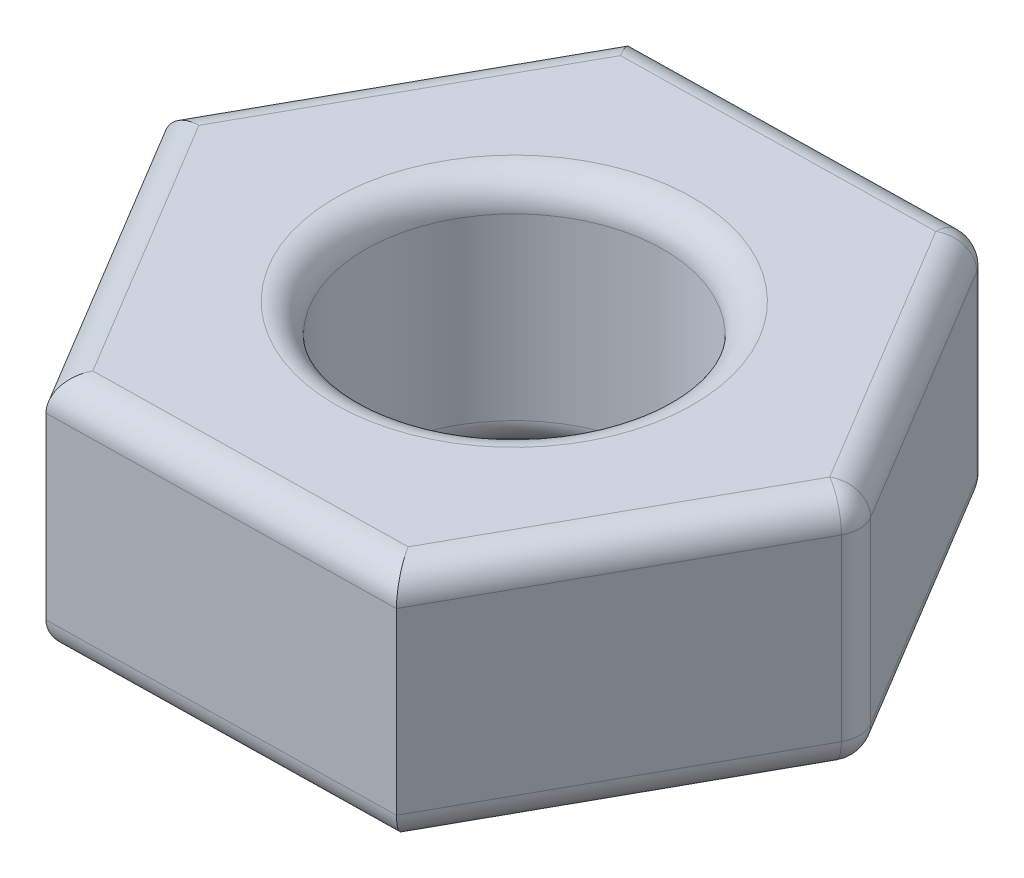
ISO-10303-21;
HEADER;
FILE_DESCRIPTION(('STEP AP214'),'2;1');
FILE_NAME('part.step','',(''),(''),'','','');
FILE_SCHEMA(('AUTOMOTIVE_DESIGN { 1 0 10303 214 1 1 1 1 }'));
ENDSEC;
DATA;
#1=APPLICATION_CONTEXT('core data for automotive mechanical design processes');
#2=APPLICATION_PROTOCOL_DEFINITION('international standard','automotive_design',2000,#1);
#3=PRODUCT_CONTEXT('',#1,'mechanical');
#4=PRODUCT('Part','Part','',(#3));
#5=PRODUCT_RELATED_PRODUCT_CATEGORY('part','',(#4));
#6=PRODUCT_DEFINITION_FORMATION('','',#4);
#7=PRODUCT_DEFINITION_CONTEXT('part definition',#1,'design');
#8=PRODUCT_DEFINITION('design','',#6,#7);
#9=PRODUCT_DEFINITION_SHAPE('','',#8);
#10=(LENGTH_UNIT() NAMED_UNIT(*) SI_UNIT(.MILLI.,.METRE.));
#11=(NAMED_UNIT(*) PLANE_ANGLE_UNIT() SI_UNIT($,.RADIAN.));
#12=(NAMED_UNIT(*) SI_UNIT($,.STERADIAN.) SOLID_ANGLE_UNIT());
#13=UNCERTAINTY_MEASURE_WITH_UNIT(LENGTH_MEASURE(1.E-05),#10,'distance_accuracy_value','');
#14=(GEOMETRIC_REPRESENTATION_CONTEXT(3) GLOBAL_UNCERTAINTY_ASSIGNED_CONTEXT((#13)) GLOBAL_UNIT_ASSIGNED_CONTEXT((#10,
#11,#12)) REPRESENTATION_CONTEXT('',''));
#15=CARTESIAN_POINT('',(0.,0.,0.));
#16=DIRECTION('',(0.,0.,1.));
#17=DIRECTION('',(1.,0.,0.));
#18=AXIS2_PLACEMENT_3D('',#15,#16,#17);
#19=CARTESIAN_POINT('',(0.,1.6,0.));
#20=DIRECTION('',(0.,1.,0.));
#21=DIRECTION('',(0.,0.,1.));
#22=AXIS2_PLACEMENT_3D('',#19,#20,#21);
#23=PLANE('',#22);
#24=CARTESIAN_POINT('',(0.,1.6,0.));
#25=DIRECTION('',(0.,1.,0.));
#26=DIRECTION('',(0.,0.,1.));
#27=AXIS2_PLACEMENT_3D('',#24,#25,#26);
#28=CIRCLE('',#27,1.2);
#29=CARTESIAN_POINT('',(0.,1.6,1.2));
#30=VERTEX_POINT('',#29);
#31=EDGE_CURVE('E11',#30,#30,#28,.F.);
#32=ORIENTED_EDGE('',*,*,#31,.T.);
#33=EDGE_LOOP('',(#32));
#34=FACE_BOUND('',#33,.T.);
#35=DIRECTION('',(0.999848212364422,0.,-0.0174227504048299));
#36=VECTOR('',#35,1.);
#37=CARTESIAN_POINT('',(1.18588621984342,1.6,1.77960872298346));
#38=LINE('',#37,#36);
#39=CARTESIAN_POINT('',(-1.00771179147456,1.6,1.81783303560122));
#40=VERTEX_POINT('',#39);
#41=CARTESIAN_POINT('',(1.07043369293195,1.6,1.78162052891071));
#42=VERTEX_POINT('',#41);
#43=EDGE_CURVE('E52',#40,#42,#38,.T.);
#44=ORIENTED_EDGE('',*,*,#43,.T.);
#45=DIRECTION('',(0.484835561727833,0.,-0.874605327038463));
#46=VECTOR('',#45,1.);
#47=CARTESIAN_POINT('',(2.13412947282177,1.6,-0.137203230890576));
#48=LINE('',#47,#46);
#49=CARTESIAN_POINT('',(2.07814548440652,1.6,-0.0362125066905078));
#50=VERTEX_POINT('',#49);
#51=EDGE_CURVE('E44',#42,#50,#48,.T.);
#52=ORIENTED_EDGE('',*,*,#51,.T.);
#53=DIRECTION('',(-0.51501265063659,0.,-0.857182576633633));
#54=VECTOR('',#53,1.);
#55=CARTESIAN_POINT('',(0.948243252978343,1.6,-1.91681195387403));
#56=LINE('',#55,#54);
#57=CARTESIAN_POINT('',(1.00771179147456,1.6,-1.81783303560121));
#58=VERTEX_POINT('',#57);
#59=EDGE_CURVE('E229',#50,#58,#56,.T.);
#60=ORIENTED_EDGE('',*,*,#59,.T.);
#61=DIRECTION('',(-0.999848212364422,0.,0.0174227504048299));
#62=VECTOR('',#61,1.);
#63=CARTESIAN_POINT('',(-1.18588621984343,1.6,-1.77960872298346));
#64=LINE('',#63,#62);
#65=CARTESIAN_POINT('',(-1.07043369293195,1.6,-1.78162052891071));
#66=VERTEX_POINT('',#65);
#67=EDGE_CURVE('E231',#58,#66,#64,.T.);
#68=ORIENTED_EDGE('',*,*,#67,.T.);
#69=DIRECTION('',(-0.484835561727832,0.,0.874605327038463));
#70=VECTOR('',#69,1.);
#71=CARTESIAN_POINT('',(-2.13412947282177,1.6,0.137203230890577));
#72=LINE('',#71,#70);
#73=CARTESIAN_POINT('',(-2.07814548440652,1.6,0.0362125066905092));
#74=VERTEX_POINT('',#73);
#75=EDGE_CURVE('E233',#66,#74,#72,.T.);
#76=ORIENTED_EDGE('',*,*,#75,.T.);
#77=DIRECTION('',(0.51501265063659,0.,0.857182576633633));
#78=VECTOR('',#77,1.);
#79=CARTESIAN_POINT('',(-0.948243252978343,1.6,1.91681195387403));
#80=LINE('',#79,#78);
#81=EDGE_CURVE('E57',#74,#40,#80,.T.);
#82=ORIENTED_EDGE('',*,*,#81,.T.);
#83=EDGE_LOOP('',(#44,#52,#60,#68,#76,#82));
#84=FACE_BOUND('',#83,.T.);
#85=ADVANCED_FACE('F35',(#34,#84),#23,.T.);
#86=CARTESIAN_POINT('',(0.,0.,0.));
#87=DIRECTION('',(0.,1.,0.));
#88=DIRECTION('',(0.,0.,1.));
#89=AXIS2_PLACEMENT_3D('',#86,#87,#88);
#90=PLANE('',#89);
#91=CARTESIAN_POINT('',(0.,0.,0.));
#92=DIRECTION('',(0.,1.,0.));
#93=DIRECTION('',(0.,0.,1.));
#94=AXIS2_PLACEMENT_3D('',#91,#92,#93);
#95=CIRCLE('',#94,1.2);
#96=CARTESIAN_POINT('',(0.,0.,1.2));
#97=VERTEX_POINT('',#96);
#98=EDGE_CURVE('E208',#97,#97,#95,.T.);
#99=ORIENTED_EDGE('',*,*,#98,.T.);
#100=EDGE_LOOP('',(#99));
#101=FACE_BOUND('',#100,.T.);
#102=DIRECTION('',(-0.484835561727832,0.,0.874605327038463));
#103=VECTOR('',#102,1.);
#104=CARTESIAN_POINT('',(-1.57428958866923,0.,-0.872704011110098));
#105=LINE('',#104,#103);
#106=CARTESIAN_POINT('',(-2.07814548440652,0.,0.0362125066905093));
#107=VERTEX_POINT('',#106);
#108=CARTESIAN_POINT('',(-1.07043369293195,0.,-1.78162052891071));
#109=VERTEX_POINT('',#108);
#110=EDGE_CURVE('E203',#107,#109,#105,.F.);
#111=ORIENTED_EDGE('',*,*,#110,.T.);
#112=DIRECTION('',(-0.999848212364422,0.,0.0174227504048299));
#113=VECTOR('',#112,1.);
#114=CARTESIAN_POINT('',(-0.0313609507286938,0.,-1.79972678225596));
#115=LINE('',#114,#113);
#116=CARTESIAN_POINT('',(1.00771179147456,0.,-1.81783303560121));
#117=VERTEX_POINT('',#116);
#118=EDGE_CURVE('E205',#109,#117,#115,.F.);
#119=ORIENTED_EDGE('',*,*,#118,.T.);
#120=DIRECTION('',(-0.51501265063659,0.,-0.857182576633633));
#121=VECTOR('',#120,1.);
#122=CARTESIAN_POINT('',(1.54292863794054,0.,-0.927022771145862));
#123=LINE('',#122,#121);
#124=CARTESIAN_POINT('',(2.07814548440652,0.,-0.0362125066905081));
#125=VERTEX_POINT('',#124);
#126=EDGE_CURVE('E195',#117,#125,#123,.F.);
#127=ORIENTED_EDGE('',*,*,#126,.T.);
#128=DIRECTION('',(0.484835561727833,0.,-0.874605327038463));
#129=VECTOR('',#128,1.);
#130=CARTESIAN_POINT('',(1.57428958866923,0.,0.872704011110099));
#131=LINE('',#130,#129);
#132=CARTESIAN_POINT('',(1.07043369293195,0.,1.78162052891071));
#133=VERTEX_POINT('',#132);
#134=EDGE_CURVE('E197',#125,#133,#131,.F.);
#135=ORIENTED_EDGE('',*,*,#134,.T.);
#136=DIRECTION('',(0.999848212364422,0.,-0.0174227504048299));
#137=VECTOR('',#136,1.);
#138=CARTESIAN_POINT('',(0.0313609507286938,0.,1.79972678225596));
#139=LINE('',#138,#137);
#140=CARTESIAN_POINT('',(-1.00771179147456,0.,1.81783303560122));
#141=VERTEX_POINT('',#140);
#142=EDGE_CURVE('E199',#133,#141,#139,.F.);
#143=ORIENTED_EDGE('',*,*,#142,.T.);
#144=DIRECTION('',(0.51501265063659,0.,0.857182576633633));
#145=VECTOR('',#144,1.);
#146=CARTESIAN_POINT('',(-1.54292863794054,0.,0.927022771145862));
#147=LINE('',#146,#145);
#148=EDGE_CURVE('E201',#141,#107,#147,.F.);
#149=ORIENTED_EDGE('',*,*,#148,.T.);
#150=EDGE_LOOP('',(#111,#119,#127,#135,#143,#149));
#151=FACE_BOUND('',#150,.T.);
#152=ADVANCED_FACE('F346',(#101,#151),#90,.F.);
#153=CARTESIAN_POINT('',(2.30905053822946,1.6,-0.0402361185450092));
#154=DIRECTION('',(-0.857182576633633,0.,0.51501265063659));
#155=DIRECTION('',(0.51501265063659,0.,0.857182576633633));
#156=AXIS2_PLACEMENT_3D('',#153,#154,#155);
#157=PLANE('',#156);
#158=DIRECTION('',(0.,-1.,0.));
#159=VECTOR('',#158,1.);
#160=CARTESIAN_POINT('',(2.24958199973324,1.6,-0.139215036817826));
#161=LINE('',#160,#159);
#162=CARTESIAN_POINT('',(2.24958199973324,1.4,-0.139215036817826));
#163=VERTEX_POINT('',#162);
#164=CARTESIAN_POINT('',(2.24958199973324,0.2,-0.139215036817826));
#165=VERTEX_POINT('',#164);
#166=EDGE_CURVE('E149',#163,#165,#161,.T.);
#167=ORIENTED_EDGE('',*,*,#166,.T.);
#168=DIRECTION('',(-0.51501265063659,0.,-0.857182576633633));
#169=VECTOR('',#168,1.);
#170=CARTESIAN_POINT('',(2.30905053822946,0.2,-0.0402361185450092));
#171=LINE('',#170,#169);
#172=CARTESIAN_POINT('',(1.17914830680129,0.2,-1.92083556572853));
#173=VERTEX_POINT('',#172);
#174=EDGE_CURVE('E145',#165,#173,#171,.T.);
#175=ORIENTED_EDGE('',*,*,#174,.T.);
#176=DIRECTION('',(0.,-1.,0.));
#177=VECTOR('',#176,1.);
#178=CARTESIAN_POINT('',(1.17914830680129,1.6,-1.92083556572853));
#179=LINE('',#178,#177);
#180=CARTESIAN_POINT('',(1.17914830680129,1.4,-1.92083556572853));
#181=VERTEX_POINT('',#180);
#182=EDGE_CURVE('E137',#173,#181,#179,.F.);
#183=ORIENTED_EDGE('',*,*,#182,.T.);
#184=DIRECTION('',(-0.51501265063659,0.,-0.857182576633633));
#185=VECTOR('',#184,1.);
#186=CARTESIAN_POINT('',(2.30905053822946,1.4,-0.0402361185450091));
#187=LINE('',#186,#185);
#188=EDGE_CURVE('E142',#181,#163,#187,.F.);
#189=ORIENTED_EDGE('',*,*,#188,.T.);
#190=EDGE_LOOP('',(#167,#175,#183,#189));
#191=FACE_BOUND('',#190,.T.);
#192=ADVANCED_FACE('F140',(#191),#157,.F.);
#193=CARTESIAN_POINT('',(1.11967976830507,1.6,-2.01981448400135));
#194=DIRECTION('',(0.0174227504048299,0.,0.999848212364422));
#195=DIRECTION('',(0.999848212364422,0.,-0.0174227504048299));
#196=AXIS2_PLACEMENT_3D('',#193,#194,#195);
#197=PLANE('',#196);
#198=DIRECTION('',(0.,-1.,0.));
#199=VECTOR('',#198,1.);
#200=CARTESIAN_POINT('',(1.0042272413936,1.6,-2.0178026780741));
#201=LINE('',#200,#199);
#202=CARTESIAN_POINT('',(1.0042272413936,1.4,-2.0178026780741));
#203=VERTEX_POINT('',#202);
#204=CARTESIAN_POINT('',(1.0042272413936,0.2,-2.0178026780741));
#205=VERTEX_POINT('',#204);
#206=EDGE_CURVE('E156',#203,#205,#201,.T.);
#207=ORIENTED_EDGE('',*,*,#206,.T.);
#208=DIRECTION('',(-0.999848212364422,0.,0.0174227504048299));
#209=VECTOR('',#208,1.);
#210=CARTESIAN_POINT('',(1.11967976830507,0.2,-2.01981448400135));
#211=LINE('',#210,#209);
#212=CARTESIAN_POINT('',(-1.18937076992439,0.2,-1.97957836545634));
#213=VERTEX_POINT('',#212);
#214=EDGE_CURVE('E193',#205,#213,#211,.T.);
#215=ORIENTED_EDGE('',*,*,#214,.T.);
#216=DIRECTION('',(0.,-1.,0.));
#217=VECTOR('',#216,1.);
#218=CARTESIAN_POINT('',(-1.18937076992439,1.6,-1.97957836545634));
#219=LINE('',#218,#217);
#220=CARTESIAN_POINT('',(-1.18937076992439,1.4,-1.97957836545634));
#221=VERTEX_POINT('',#220);
#222=EDGE_CURVE('E174',#221,#213,#219,.T.);
#223=ORIENTED_EDGE('',*,*,#222,.F.);
#224=DIRECTION('',(-0.999848212364422,0.,0.0174227504048299));
#225=VECTOR('',#224,1.);
#226=CARTESIAN_POINT('',(1.11967976830507,1.4,-2.01981448400135));
#227=LINE('',#226,#225);
#228=EDGE_CURVE('E190',#221,#203,#227,.F.);
#229=ORIENTED_EDGE('',*,*,#228,.T.);
#230=EDGE_LOOP('',(#207,#215,#223,#229));
#231=FACE_BOUND('',#230,.T.);
#232=ADVANCED_FACE('F332',(#231),#197,.F.);
#233=CARTESIAN_POINT('',(-1.18937076992439,1.6,-1.97957836545634));
#234=DIRECTION('',(0.874605327038463,0.,0.484835561727832));
#235=DIRECTION('',(0.484835561727832,0.,-0.874605327038463));
#236=AXIS2_PLACEMENT_3D('',#233,#234,#235);
#237=PLANE('',#236);
#238=ORIENTED_EDGE('',*,*,#222,.T.);
#239=DIRECTION('',(-0.484835561727832,0.,0.874605327038463));
#240=VECTOR('',#239,1.);
#241=CARTESIAN_POINT('',(-1.18937076992439,0.2,-1.97957836545634));
#242=LINE('',#241,#240);
#243=CARTESIAN_POINT('',(-2.30905053822946,0.2,0.0402361185450104));
#244=VERTEX_POINT('',#243);
#245=EDGE_CURVE('E219',#213,#244,#242,.T.);
#246=ORIENTED_EDGE('',*,*,#245,.T.);
#247=DIRECTION('',(0.,-1.,0.));
#248=VECTOR('',#247,1.);
#249=CARTESIAN_POINT('',(-2.30905053822946,1.6,0.0402361185450104));
#250=LINE('',#249,#248);
#251=CARTESIAN_POINT('',(-2.30905053822946,1.4,0.0402361185450104));
#252=VERTEX_POINT('',#251);
#253=EDGE_CURVE('E177',#252,#244,#250,.T.);
#254=ORIENTED_EDGE('',*,*,#253,.F.);
#255=DIRECTION('',(-0.484835561727832,0.,0.874605327038463));
#256=VECTOR('',#255,1.);
#257=CARTESIAN_POINT('',(-1.18937076992439,1.4,-1.97957836545634));
#258=LINE('',#257,#256);
#259=EDGE_CURVE('E217',#252,#221,#258,.F.);
#260=ORIENTED_EDGE('',*,*,#259,.T.);
#261=EDGE_LOOP('',(#238,#246,#254,#260));
#262=FACE_BOUND('',#261,.T.);
#263=ADVANCED_FACE('F336',(#262),#237,.F.);
#264=CARTESIAN_POINT('',(-2.30905053822946,1.6,0.0402361185450104));
#265=DIRECTION('',(0.857182576633633,0.,-0.51501265063659));
#266=DIRECTION('',(-0.51501265063659,0.,-0.857182576633633));
#267=AXIS2_PLACEMENT_3D('',#264,#265,#266);
#268=PLANE('',#267);
#269=ORIENTED_EDGE('',*,*,#253,.T.);
#270=DIRECTION('',(0.51501265063659,0.,0.857182576633633));
#271=VECTOR('',#270,1.);
#272=CARTESIAN_POINT('',(-2.30905053822946,0.2,0.0402361185450104));
#273=LINE('',#272,#271);
#274=CARTESIAN_POINT('',(-1.11967976830507,0.2,2.01981448400135));
#275=VERTEX_POINT('',#274);
#276=EDGE_CURVE('E223',#244,#275,#273,.T.);
#277=ORIENTED_EDGE('',*,*,#276,.T.);
#278=DIRECTION('',(0.,-1.,0.));
#279=VECTOR('',#278,1.);
#280=CARTESIAN_POINT('',(-1.11967976830507,1.6,2.01981448400135));
#281=LINE('',#280,#279);
#282=CARTESIAN_POINT('',(-1.11967976830507,1.4,2.01981448400135));
#283=VERTEX_POINT('',#282);
#284=EDGE_CURVE('E287',#283,#275,#281,.T.);
#285=ORIENTED_EDGE('',*,*,#284,.F.);
#286=DIRECTION('',(0.51501265063659,0.,0.857182576633633));
#287=VECTOR('',#286,1.);
#288=CARTESIAN_POINT('',(-2.30905053822946,1.4,0.0402361185450103));
#289=LINE('',#288,#287);
#290=EDGE_CURVE('E221',#283,#252,#289,.F.);
#291=ORIENTED_EDGE('',*,*,#290,.T.);
#292=EDGE_LOOP('',(#269,#277,#285,#291));
#293=FACE_BOUND('',#292,.T.);
#294=ADVANCED_FACE('F298',(#293),#268,.F.);
#295=CARTESIAN_POINT('',(-1.11967976830507,1.6,2.01981448400135));
#296=DIRECTION('',(-0.0174227504048299,0.,-0.999848212364422));
#297=DIRECTION('',(-0.999848212364422,0.,0.0174227504048299));
#298=AXIS2_PLACEMENT_3D('',#295,#296,#297);
#299=PLANE('',#298);
#300=ORIENTED_EDGE('',*,*,#284,.T.);
#301=DIRECTION('',(0.999848212364422,0.,-0.0174227504048299));
#302=VECTOR('',#301,1.);
#303=CARTESIAN_POINT('',(-1.11967976830507,0.2,2.01981448400135));
#304=LINE('',#303,#302);
#305=CARTESIAN_POINT('',(1.18937076992439,0.2,1.97957836545634));
#306=VERTEX_POINT('',#305);
#307=EDGE_CURVE('E227',#275,#306,#304,.T.);
#308=ORIENTED_EDGE('',*,*,#307,.T.);
#309=DIRECTION('',(0.,-1.,0.));
#310=VECTOR('',#309,1.);
#311=CARTESIAN_POINT('',(1.18937076992439,1.6,1.97957836545634));
#312=LINE('',#311,#310);
#313=CARTESIAN_POINT('',(1.18937076992439,1.4,1.97957836545634));
#314=VERTEX_POINT('',#313);
#315=EDGE_CURVE('E282',#314,#306,#312,.T.);
#316=ORIENTED_EDGE('',*,*,#315,.F.);
#317=DIRECTION('',(0.999848212364422,0.,-0.0174227504048299));
#318=VECTOR('',#317,1.);
#319=CARTESIAN_POINT('',(-1.11967976830507,1.4,2.01981448400135));
#320=LINE('',#319,#318);
#321=EDGE_CURVE('E225',#314,#283,#320,.F.);
#322=ORIENTED_EDGE('',*,*,#321,.T.);
#323=EDGE_LOOP('',(#300,#308,#316,#322));
#324=FACE_BOUND('',#323,.T.);
#325=ADVANCED_FACE('F318',(#324),#299,.F.);
#326=CARTESIAN_POINT('',(1.18937076992439,1.6,1.97957836545634));
#327=DIRECTION('',(-0.874605327038463,0.,-0.484835561727833));
#328=DIRECTION('',(-0.484835561727833,0.,0.874605327038463));
#329=AXIS2_PLACEMENT_3D('',#326,#327,#328);
#330=PLANE('',#329);
#331=ORIENTED_EDGE('',*,*,#315,.T.);
#332=DIRECTION('',(0.484835561727833,0.,-0.874605327038463));
#333=VECTOR('',#332,1.);
#334=CARTESIAN_POINT('',(1.18937076992439,0.2,1.97957836545634));
#335=LINE('',#334,#333);
#336=CARTESIAN_POINT('',(2.25306654981421,0.2,0.0607546056550584));
#337=VERTEX_POINT('',#336);
#338=EDGE_CURVE('E188',#306,#337,#335,.T.);
#339=ORIENTED_EDGE('',*,*,#338,.T.);
#340=DIRECTION('',(0.,-1.,0.));
#341=VECTOR('',#340,1.);
#342=CARTESIAN_POINT('',(2.25306654981421,1.6,0.0607546056550581));
#343=LINE('',#342,#341);
#344=CARTESIAN_POINT('',(2.25306654981421,1.4,0.0607546056550584));
#345=VERTEX_POINT('',#344);
#346=EDGE_CURVE('E185',#337,#345,#343,.F.);
#347=ORIENTED_EDGE('',*,*,#346,.T.);
#348=DIRECTION('',(0.484835561727833,0.,-0.874605327038463));
#349=VECTOR('',#348,1.);
#350=CARTESIAN_POINT('',(1.18937076992439,1.4,1.97957836545634));
#351=LINE('',#350,#349);
#352=EDGE_CURVE('E183',#345,#314,#351,.F.);
#353=ORIENTED_EDGE('',*,*,#352,.T.);
#354=EDGE_LOOP('',(#331,#339,#347,#353));
#355=FACE_BOUND('',#354,.T.);
#356=ADVANCED_FACE('F357',(#355),#330,.F.);
#357=CARTESIAN_POINT('',(0.,1.6,0.));
#358=DIRECTION('',(0.,-1.,0.));
#359=DIRECTION('',(0.,0.,-1.));
#360=AXIS2_PLACEMENT_3D('',#357,#358,#359);
#361=CYLINDRICAL_SURFACE('',#360,1.);
#362=CARTESIAN_POINT('',(0.,0.2,0.));
#363=DIRECTION('',(0.,1.,0.));
#364=DIRECTION('',(0.,0.,1.));
#365=AXIS2_PLACEMENT_3D('',#362,#363,#364);
#366=CIRCLE('',#365,1.);
#367=CARTESIAN_POINT('',(0.,0.2,1.));
#368=VERTEX_POINT('',#367);
#369=EDGE_CURVE('E214',#368,#368,#366,.F.);
#370=ORIENTED_EDGE('',*,*,#369,.T.);
#371=EDGE_LOOP('',(#370));
#372=FACE_BOUND('',#371,.T.);
#373=CARTESIAN_POINT('',(0.,1.4,0.));
#374=DIRECTION('',(0.,1.,0.));
#375=DIRECTION('',(0.,0.,1.));
#376=AXIS2_PLACEMENT_3D('',#373,#374,#375);
#377=CIRCLE('',#376,1.);
#378=CARTESIAN_POINT('',(0.,1.4,1.));
#379=VERTEX_POINT('',#378);
#380=EDGE_CURVE('E211',#379,#379,#377,.T.);
#381=ORIENTED_EDGE('',*,*,#380,.T.);
#382=EDGE_LOOP('',(#381));
#383=FACE_BOUND('',#382,.T.);
#384=ADVANCED_FACE('F355',(#372,#383),#361,.F.);
#385=CARTESIAN_POINT('',(-1.57428958866923,1.4,-0.872704011110098));
#386=DIRECTION('',(0.484835561727832,0.,-0.874605327038463));
#387=DIRECTION('',(-0.874605327038463,0.,-0.484835561727832));
#388=AXIS2_PLACEMENT_3D('',#385,#386,#387);
#389=CYLINDRICAL_SURFACE('',#388,0.2);
#390=CARTESIAN_POINT('',(-1.07043369293195,1.4,-1.78162052891071));
#391=DIRECTION('',(0.857182576633633,0.,-0.51501265063659));
#392=DIRECTION('',(0.51501265063659,0.,0.857182576633633));
#393=AXIS2_PLACEMENT_3D('',#390,#391,#392);
#394=ELLIPSE('',#393,0.23094010767585,0.2);
#395=EDGE_CURVE('E275',#221,#66,#394,.T.);
#396=ORIENTED_EDGE('',*,*,#395,.F.);
#397=ORIENTED_EDGE('',*,*,#259,.F.);
#398=CARTESIAN_POINT('',(-2.07814548440652,1.4,0.0362125066905091));
#399=DIRECTION('',(-0.0174227504048304,0.,-0.999848212364422));
#400=DIRECTION('',(0.999848212364422,0.,-0.0174227504048305));
#401=AXIS2_PLACEMENT_3D('',#398,#399,#400);
#402=ELLIPSE('',#401,0.23094010767585,0.2);
#403=EDGE_CURVE('E39',#74,#252,#402,.F.);
#404=ORIENTED_EDGE('',*,*,#403,.F.);
#405=ORIENTED_EDGE('',*,*,#75,.F.);
#406=EDGE_LOOP('',(#396,#397,#404,#405));
#407=FACE_BOUND('',#406,.T.);
#408=ADVANCED_FACE('F335',(#407),#389,.T.);
#409=CARTESIAN_POINT('',(-1.0144497045167,0.2,-1.88261125311077));
#410=DIRECTION('',(-0.484835561727832,0.,0.874605327038463));
#411=DIRECTION('',(0.874605327038463,0.,0.484835561727832));
#412=AXIS2_PLACEMENT_3D('',#409,#410,#411);
#413=CYLINDRICAL_SURFACE('',#412,0.2);
#414=CARTESIAN_POINT('',(-2.07814548440652,0.2,0.0362125066905098));
#415=DIRECTION('',(0.0174227504048304,0.,0.999848212364422));
#416=DIRECTION('',(0.999848212364422,0.,-0.0174227504048305));
#417=AXIS2_PLACEMENT_3D('',#414,#415,#416);
#418=ELLIPSE('',#417,0.23094010767585,0.2);
#419=EDGE_CURVE('E270',#244,#107,#418,.T.);
#420=ORIENTED_EDGE('',*,*,#419,.F.);
#421=ORIENTED_EDGE('',*,*,#245,.F.);
#422=CARTESIAN_POINT('',(-1.07043369293195,0.2,-1.78162052891071));
#423=DIRECTION('',(-0.857182576633633,0.,0.51501265063659));
#424=DIRECTION('',(0.51501265063659,0.,0.857182576633633));
#425=AXIS2_PLACEMENT_3D('',#422,#423,#424);
#426=ELLIPSE('',#425,0.23094010767585,0.2);
#427=EDGE_CURVE('E273',#109,#213,#426,.F.);
#428=ORIENTED_EDGE('',*,*,#427,.F.);
#429=ORIENTED_EDGE('',*,*,#110,.F.);
#430=EDGE_LOOP('',(#420,#421,#428,#429));
#431=FACE_BOUND('',#430,.T.);
#432=ADVANCED_FACE('F306',(#431),#413,.T.);
#433=CARTESIAN_POINT('',(-1.54292863794054,1.4,0.927022771145862));
#434=DIRECTION('',(-0.51501265063659,0.,-0.857182576633633));
#435=DIRECTION('',(-0.857182576633633,0.,0.51501265063659));
#436=AXIS2_PLACEMENT_3D('',#433,#434,#435);
#437=CYLINDRICAL_SURFACE('',#436,0.2);
#438=ORIENTED_EDGE('',*,*,#403,.T.);
#439=ORIENTED_EDGE('',*,*,#290,.F.);
#440=CARTESIAN_POINT('',(-1.00771179147456,1.4,1.81783303560122));
#441=DIRECTION('',(-0.874605327038463,0.,-0.484835561727833));
#442=DIRECTION('',(0.484835561727833,0.,-0.874605327038463));
#443=AXIS2_PLACEMENT_3D('',#440,#441,#442);
#444=ELLIPSE('',#443,0.23094010767585,0.2);
#445=EDGE_CURVE('E267',#40,#283,#444,.F.);
#446=ORIENTED_EDGE('',*,*,#445,.F.);
#447=ORIENTED_EDGE('',*,*,#81,.F.);
#448=EDGE_LOOP('',(#438,#439,#446,#447));
#449=FACE_BOUND('',#448,.T.);
#450=ADVANCED_FACE('F320',(#449),#437,.T.);
#451=CARTESIAN_POINT('',(-0.0313609507286938,1.4,-1.79972678225596));
#452=DIRECTION('',(0.999848212364422,0.,-0.0174227504048299));
#453=DIRECTION('',(-0.0174227504048299,0.,-0.999848212364422));
#454=AXIS2_PLACEMENT_3D('',#451,#452,#453);
#455=CYLINDRICAL_SURFACE('',#454,0.2);
#456=ORIENTED_EDGE('',*,*,#395,.T.);
#457=ORIENTED_EDGE('',*,*,#67,.F.);
#458=CARTESIAN_POINT('',(1.00771179147456,1.4,-1.81783303560121));
#459=DIRECTION('',(0.999848212364422,0.,-0.0174227504048301));
#460=DIRECTION('',(-0.0174227504048301,0.,-0.999848212364422));
#461=AXIS2_PLACEMENT_3D('',#458,#459,#460);
#462=CIRCLE('',#461,0.2);
#463=EDGE_CURVE('E160',#203,#58,#462,.T.);
#464=ORIENTED_EDGE('',*,*,#463,.F.);
#465=ORIENTED_EDGE('',*,*,#228,.F.);
#466=EDGE_LOOP('',(#456,#457,#464,#465));
#467=FACE_BOUND('',#466,.T.);
#468=ADVANCED_FACE('F329',(#467),#455,.T.);
#469=CARTESIAN_POINT('',(1.00771179147456,1.6,-1.81783303560121));
#470=DIRECTION('',(0.,-1.,0.));
#471=DIRECTION('',(0.,0.,-1.));
#472=AXIS2_PLACEMENT_3D('',#469,#470,#471);
#473=CYLINDRICAL_SURFACE('',#472,0.2);
#474=CARTESIAN_POINT('',(1.00771179147456,0.2,-1.81783303560121));
#475=DIRECTION('',(0.,-1.,0.));
#476=DIRECTION('',(0.,0.,-1.));
#477=AXIS2_PLACEMENT_3D('',#474,#475,#476);
#478=CIRCLE('',#477,0.2);
#479=EDGE_CURVE('E161',#205,#173,#478,.T.);
#480=ORIENTED_EDGE('',*,*,#479,.F.);
#481=ORIENTED_EDGE('',*,*,#206,.F.);
#482=CARTESIAN_POINT('',(1.00771179147456,1.4,-1.81783303560121));
#483=DIRECTION('',(0.,1.,0.));
#484=DIRECTION('',(0.,0.,1.));
#485=AXIS2_PLACEMENT_3D('',#482,#483,#484);
#486=CIRCLE('',#485,0.2);
#487=EDGE_CURVE('E153',#181,#203,#486,.T.);
#488=ORIENTED_EDGE('',*,*,#487,.F.);
#489=ORIENTED_EDGE('',*,*,#182,.F.);
#490=EDGE_LOOP('',(#480,#481,#488,#489));
#491=FACE_BOUND('',#490,.T.);
#492=ADVANCED_FACE('F155',(#491),#473,.T.);
#493=CARTESIAN_POINT('',(1.12316431838604,0.2,-1.81984484152846));
#494=DIRECTION('',(-0.999848212364422,0.,0.0174227504048299));
#495=DIRECTION('',(0.0174227504048299,0.,0.999848212364422));
#496=AXIS2_PLACEMENT_3D('',#493,#494,#495);
#497=CYLINDRICAL_SURFACE('',#496,0.2);
#498=ORIENTED_EDGE('',*,*,#427,.T.);
#499=ORIENTED_EDGE('',*,*,#214,.F.);
#500=CARTESIAN_POINT('',(1.00771179147456,0.2,-1.81783303560121));
#501=DIRECTION('',(0.999848212364422,0.,-0.0174227504048301));
#502=DIRECTION('',(-0.0174227504048301,0.,-0.999848212364422));
#503=AXIS2_PLACEMENT_3D('',#500,#501,#502);
#504=CIRCLE('',#503,0.2);
#505=EDGE_CURVE('E262',#117,#205,#504,.T.);
#506=ORIENTED_EDGE('',*,*,#505,.F.);
#507=ORIENTED_EDGE('',*,*,#118,.F.);
#508=EDGE_LOOP('',(#498,#499,#506,#507));
#509=FACE_BOUND('',#508,.T.);
#510=ADVANCED_FACE('F405',(#509),#497,.T.);
#511=CARTESIAN_POINT('',(-2.13761402290273,0.2,-0.0627664115823076));
#512=DIRECTION('',(0.51501265063659,0.,0.857182576633633));
#513=DIRECTION('',(0.857182576633633,0.,-0.51501265063659));
#514=AXIS2_PLACEMENT_3D('',#511,#512,#513);
#515=CYLINDRICAL_SURFACE('',#514,0.2);
#516=ORIENTED_EDGE('',*,*,#419,.T.);
#517=ORIENTED_EDGE('',*,*,#148,.F.);
#518=CARTESIAN_POINT('',(-1.00771179147456,0.2,1.81783303560122));
#519=DIRECTION('',(0.874605327038463,0.,0.484835561727833));
#520=DIRECTION('',(0.484835561727833,0.,-0.874605327038463));
#521=AXIS2_PLACEMENT_3D('',#518,#519,#520);
#522=ELLIPSE('',#521,0.23094010767585,0.2);
#523=EDGE_CURVE('E259',#275,#141,#522,.T.);
#524=ORIENTED_EDGE('',*,*,#523,.F.);
#525=ORIENTED_EDGE('',*,*,#276,.F.);
#526=EDGE_LOOP('',(#516,#517,#524,#525));
#527=FACE_BOUND('',#526,.T.);
#528=ADVANCED_FACE('F311',(#527),#515,.T.);
#529=CARTESIAN_POINT('',(0.0313609507286938,1.4,1.79972678225596));
#530=DIRECTION('',(-0.999848212364422,0.,0.0174227504048299));
#531=DIRECTION('',(0.0174227504048299,0.,0.999848212364422));
#532=AXIS2_PLACEMENT_3D('',#529,#530,#531);
#533=CYLINDRICAL_SURFACE('',#532,0.2);
#534=ORIENTED_EDGE('',*,*,#445,.T.);
#535=ORIENTED_EDGE('',*,*,#321,.F.);
#536=CARTESIAN_POINT('',(1.07043369293195,1.4,1.78162052891071));
#537=DIRECTION('',(-0.857182576633633,0.,0.51501265063659));
#538=DIRECTION('',(-0.51501265063659,0.,-0.857182576633633));
#539=AXIS2_PLACEMENT_3D('',#536,#537,#538);
#540=ELLIPSE('',#539,0.23094010767585,0.2);
#541=EDGE_CURVE('E168',#42,#314,#540,.F.);
#542=ORIENTED_EDGE('',*,*,#541,.F.);
#543=ORIENTED_EDGE('',*,*,#43,.F.);
#544=EDGE_LOOP('',(#534,#535,#542,#543));
#545=FACE_BOUND('',#544,.T.);
#546=ADVANCED_FACE('F322',(#545),#533,.T.);
#547=CARTESIAN_POINT('',(1.00771179147456,1.4,-1.81783303560121));
#548=DIRECTION('',(0.,0.,1.));
#549=DIRECTION('',(1.,0.,0.));
#550=AXIS2_PLACEMENT_3D('',#547,#548,#549);
#551=SPHERICAL_SURFACE('',#550,0.2);
#552=ORIENTED_EDGE('',*,*,#487,.T.);
#553=ORIENTED_EDGE('',*,*,#463,.T.);
#554=CARTESIAN_POINT('',(1.00771179147456,1.4,-1.81783303560121));
#555=DIRECTION('',(-0.515012650636589,0.,-0.857182576633633));
#556=DIRECTION('',(-0.857182576633633,0.,0.515012650636589));
#557=AXIS2_PLACEMENT_3D('',#554,#555,#556);
#558=CIRCLE('',#557,0.2);
#559=EDGE_CURVE('E164',#181,#58,#558,.F.);
#560=ORIENTED_EDGE('',*,*,#559,.F.);
#561=EDGE_LOOP('',(#552,#553,#560));
#562=FACE_BOUND('',#561,.T.);
#563=ADVANCED_FACE('F165',(#562),#551,.T.);
#564=CARTESIAN_POINT('',(1.00771179147456,0.2,-1.81783303560121));
#565=DIRECTION('',(0.,0.,1.));
#566=DIRECTION('',(1.,0.,0.));
#567=AXIS2_PLACEMENT_3D('',#564,#565,#566);
#568=SPHERICAL_SURFACE('',#567,0.2);
#569=ORIENTED_EDGE('',*,*,#505,.T.);
#570=ORIENTED_EDGE('',*,*,#479,.T.);
#571=CARTESIAN_POINT('',(1.00771179147456,0.2,-1.81783303560121));
#572=DIRECTION('',(-0.51501265063659,0.,-0.857182576633633));
#573=DIRECTION('',(-0.857182576633633,0.,0.51501265063659));
#574=AXIS2_PLACEMENT_3D('',#571,#572,#573);
#575=CIRCLE('',#574,0.2);
#576=EDGE_CURVE('E169',#117,#173,#575,.F.);
#577=ORIENTED_EDGE('',*,*,#576,.F.);
#578=EDGE_LOOP('',(#569,#570,#577));
#579=FACE_BOUND('',#578,.T.);
#580=ADVANCED_FACE('F431',(#579),#568,.T.);
#581=CARTESIAN_POINT('',(-1.12316431838604,0.2,1.81984484152847));
#582=DIRECTION('',(0.999848212364422,0.,-0.0174227504048299));
#583=DIRECTION('',(-0.0174227504048299,0.,-0.999848212364422));
#584=AXIS2_PLACEMENT_3D('',#581,#582,#583);
#585=CYLINDRICAL_SURFACE('',#584,0.2);
#586=ORIENTED_EDGE('',*,*,#523,.T.);
#587=ORIENTED_EDGE('',*,*,#142,.F.);
#588=CARTESIAN_POINT('',(1.07043369293195,0.2,1.78162052891071));
#589=DIRECTION('',(0.857182576633633,0.,-0.51501265063659));
#590=DIRECTION('',(-0.51501265063659,0.,-0.857182576633633));
#591=AXIS2_PLACEMENT_3D('',#588,#589,#590);
#592=ELLIPSE('',#591,0.23094010767585,0.2);
#593=EDGE_CURVE('E252',#306,#133,#592,.T.);
#594=ORIENTED_EDGE('',*,*,#593,.F.);
#595=ORIENTED_EDGE('',*,*,#307,.F.);
#596=EDGE_LOOP('',(#586,#587,#594,#595));
#597=FACE_BOUND('',#596,.T.);
#598=ADVANCED_FACE('F315',(#597),#585,.T.);
#599=CARTESIAN_POINT('',(1.57428958866923,1.4,0.872704011110099));
#600=DIRECTION('',(-0.484835561727833,0.,0.874605327038463));
#601=DIRECTION('',(0.874605327038463,0.,0.484835561727833));
#602=AXIS2_PLACEMENT_3D('',#599,#600,#601);
#603=CYLINDRICAL_SURFACE('',#602,0.2);
#604=ORIENTED_EDGE('',*,*,#541,.T.);
#605=ORIENTED_EDGE('',*,*,#352,.F.);
#606=CARTESIAN_POINT('',(2.07814548440652,1.4,-0.0362125066905079));
#607=DIRECTION('',(0.484835561727832,0.,-0.874605327038463));
#608=DIRECTION('',(-0.874605327038463,0.,-0.484835561727832));
#609=AXIS2_PLACEMENT_3D('',#606,#607,#608);
#610=CIRCLE('',#609,0.2);
#611=EDGE_CURVE('E249',#50,#345,#610,.T.);
#612=ORIENTED_EDGE('',*,*,#611,.F.);
#613=ORIENTED_EDGE('',*,*,#51,.F.);
#614=EDGE_LOOP('',(#604,#605,#612,#613));
#615=FACE_BOUND('',#614,.T.);
#616=ADVANCED_FACE('F327',(#615),#603,.T.);
#617=CARTESIAN_POINT('',(1.54292863794054,1.4,-0.927022771145862));
#618=DIRECTION('',(0.51501265063659,0.,0.857182576633633));
#619=DIRECTION('',(0.857182576633633,0.,-0.51501265063659));
#620=AXIS2_PLACEMENT_3D('',#617,#618,#619);
#621=CYLINDRICAL_SURFACE('',#620,0.2);
#622=ORIENTED_EDGE('',*,*,#559,.T.);
#623=ORIENTED_EDGE('',*,*,#59,.F.);
#624=CARTESIAN_POINT('',(2.07814548440652,1.4,-0.0362125066905081));
#625=DIRECTION('',(0.51501265063659,0.,0.857182576633633));
#626=DIRECTION('',(0.857182576633633,0.,-0.51501265063659));
#627=AXIS2_PLACEMENT_3D('',#624,#625,#626);
#628=CIRCLE('',#627,0.2);
#629=EDGE_CURVE('E172',#163,#50,#628,.T.);
#630=ORIENTED_EDGE('',*,*,#629,.F.);
#631=ORIENTED_EDGE('',*,*,#188,.F.);
#632=EDGE_LOOP('',(#622,#623,#630,#631));
#633=FACE_BOUND('',#632,.T.);
#634=ADVANCED_FACE('F171',(#633),#621,.T.);
#635=CARTESIAN_POINT('',(2.13761402290274,0.2,0.0627664115823088));
#636=DIRECTION('',(-0.51501265063659,0.,-0.857182576633633));
#637=DIRECTION('',(-0.857182576633633,0.,0.51501265063659));
#638=AXIS2_PLACEMENT_3D('',#635,#636,#637);
#639=CYLINDRICAL_SURFACE('',#638,0.2);
#640=ORIENTED_EDGE('',*,*,#576,.T.);
#641=ORIENTED_EDGE('',*,*,#174,.F.);
#642=CARTESIAN_POINT('',(2.07814548440652,0.2,-0.0362125066905081));
#643=DIRECTION('',(0.51501265063659,0.,0.857182576633633));
#644=DIRECTION('',(0.857182576633633,0.,-0.51501265063659));
#645=AXIS2_PLACEMENT_3D('',#642,#643,#644);
#646=CIRCLE('',#645,0.2);
#647=EDGE_CURVE('E245',#125,#165,#646,.T.);
#648=ORIENTED_EDGE('',*,*,#647,.F.);
#649=ORIENTED_EDGE('',*,*,#126,.F.);
#650=EDGE_LOOP('',(#640,#641,#648,#649));
#651=FACE_BOUND('',#650,.T.);
#652=ADVANCED_FACE('F457',(#651),#639,.T.);
#653=CARTESIAN_POINT('',(1.0144497045167,0.2,1.88261125311077));
#654=DIRECTION('',(0.484835561727833,0.,-0.874605327038463));
#655=DIRECTION('',(-0.874605327038463,0.,-0.484835561727833));
#656=AXIS2_PLACEMENT_3D('',#653,#654,#655);
#657=CYLINDRICAL_SURFACE('',#656,0.2);
#658=ORIENTED_EDGE('',*,*,#593,.T.);
#659=ORIENTED_EDGE('',*,*,#134,.F.);
#660=CARTESIAN_POINT('',(2.07814548440652,0.2,-0.0362125066905082));
#661=DIRECTION('',(0.484835561727833,0.,-0.874605327038463));
#662=DIRECTION('',(-0.874605327038463,0.,-0.484835561727833));
#663=AXIS2_PLACEMENT_3D('',#660,#661,#662);
#664=CIRCLE('',#663,0.2);
#665=EDGE_CURVE('E242',#337,#125,#664,.T.);
#666=ORIENTED_EDGE('',*,*,#665,.F.);
#667=ORIENTED_EDGE('',*,*,#338,.F.);
#668=EDGE_LOOP('',(#658,#659,#666,#667));
#669=FACE_BOUND('',#668,.T.);
#670=ADVANCED_FACE('F464',(#669),#657,.T.);
#671=CARTESIAN_POINT('',(2.07814548440652,1.4,-0.0362125066905083));
#672=DIRECTION('',(0.,0.,1.));
#673=DIRECTION('',(1.,0.,0.));
#674=AXIS2_PLACEMENT_3D('',#671,#672,#673);
#675=SPHERICAL_SURFACE('',#674,0.2);
#676=ORIENTED_EDGE('',*,*,#629,.T.);
#677=ORIENTED_EDGE('',*,*,#611,.T.);
#678=CARTESIAN_POINT('',(2.07814548440652,1.4,-0.0362125066905082));
#679=DIRECTION('',(0.,1.,0.));
#680=DIRECTION('',(0.,0.,1.));
#681=AXIS2_PLACEMENT_3D('',#678,#679,#680);
#682=CIRCLE('',#681,0.2);
#683=EDGE_CURVE('E240',#163,#345,#682,.F.);
#684=ORIENTED_EDGE('',*,*,#683,.F.);
#685=EDGE_LOOP('',(#676,#677,#684));
#686=FACE_BOUND('',#685,.T.);
#687=ADVANCED_FACE('F472',(#686),#675,.T.);
#688=CARTESIAN_POINT('',(2.07814548440652,0.2,-0.0362125066905082));
#689=DIRECTION('',(0.,0.,1.));
#690=DIRECTION('',(1.,0.,0.));
#691=AXIS2_PLACEMENT_3D('',#688,#689,#690);
#692=SPHERICAL_SURFACE('',#691,0.2);
#693=ORIENTED_EDGE('',*,*,#665,.T.);
#694=ORIENTED_EDGE('',*,*,#647,.T.);
#695=CARTESIAN_POINT('',(2.07814548440652,0.2,-0.0362125066905082));
#696=DIRECTION('',(0.,-1.,0.));
#697=DIRECTION('',(0.,0.,-1.));
#698=AXIS2_PLACEMENT_3D('',#695,#696,#697);
#699=CIRCLE('',#698,0.2);
#700=EDGE_CURVE('E238',#337,#165,#699,.F.);
#701=ORIENTED_EDGE('',*,*,#700,.F.);
#702=EDGE_LOOP('',(#693,#694,#701));
#703=FACE_BOUND('',#702,.T.);
#704=ADVANCED_FACE('F480',(#703),#692,.T.);
#705=CARTESIAN_POINT('',(2.07814548440652,1.6,-0.0362125066905082));
#706=DIRECTION('',(0.,-1.,0.));
#707=DIRECTION('',(0.,0.,-1.));
#708=AXIS2_PLACEMENT_3D('',#705,#706,#707);
#709=CYLINDRICAL_SURFACE('',#708,0.2);
#710=ORIENTED_EDGE('',*,*,#683,.T.);
#711=ORIENTED_EDGE('',*,*,#346,.F.);
#712=ORIENTED_EDGE('',*,*,#700,.T.);
#713=ORIENTED_EDGE('',*,*,#166,.F.);
#714=EDGE_LOOP('',(#710,#711,#712,#713));
#715=FACE_BOUND('',#714,.T.);
#716=ADVANCED_FACE('F488',(#715),#709,.T.);
#717=CARTESIAN_POINT('',(0.,0.2,0.));
#718=DIRECTION('',(0.,1.,0.));
#719=DIRECTION('',(0.,0.,1.));
#720=AXIS2_PLACEMENT_3D('',#717,#718,#719);
#721=TOROIDAL_SURFACE('',#720,1.2,0.2);
#722=ORIENTED_EDGE('',*,*,#369,.F.);
#723=EDGE_LOOP('',(#722));
#724=FACE_BOUND('',#723,.T.);
#725=ORIENTED_EDGE('',*,*,#98,.F.);
#726=EDGE_LOOP('',(#725));
#727=FACE_BOUND('',#726,.T.);
#728=ADVANCED_FACE('F496',(#724,#727),#721,.T.);
#729=CARTESIAN_POINT('',(0.,1.4,0.));
#730=DIRECTION('',(0.,1.,0.));
#731=DIRECTION('',(0.,0.,1.));
#732=AXIS2_PLACEMENT_3D('',#729,#730,#731);
#733=TOROIDAL_SURFACE('',#732,1.2,0.2);
#734=ORIENTED_EDGE('',*,*,#31,.F.);
#735=EDGE_LOOP('',(#734));
#736=FACE_BOUND('',#735,.T.);
#737=ORIENTED_EDGE('',*,*,#380,.F.);
#738=EDGE_LOOP('',(#737));
#739=FACE_BOUND('',#738,.T.);
#740=ADVANCED_FACE('F37',(#736,#739),#733,.T.);
#741=CLOSED_SHELL('',(#85,#152,#192,#232,#263,#294,#325,#356,#384,#408,#432,#450,#468,#492,#510,
#528,#546,#563,#580,#598,#616,#634,#652,#670,#687,#704,#716,#728,#740));
#742=MANIFOLD_SOLID_BREP('B2',#741);
#743=ADVANCED_BREP_SHAPE_REPRESENTATION('',(#18,#742),#14);
#744=SHAPE_DEFINITION_REPRESENTATION(#9,#743);
ENDSEC;
END-ISO-10303-21;
